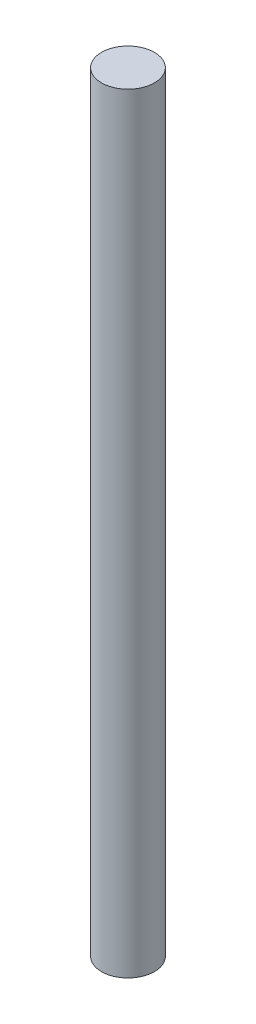
ISO-10303-21;
HEADER;
FILE_DESCRIPTION(('STEP AP214'),'2;1');
FILE_NAME('part.step','',(''),(''),'','','');
FILE_SCHEMA(('AUTOMOTIVE_DESIGN { 1 0 10303 214 1 1 1 1 }'));
ENDSEC;
DATA;
#1=APPLICATION_CONTEXT('core data for automotive mechanical design processes');
#2=APPLICATION_PROTOCOL_DEFINITION('international standard','automotive_design',2000,#1);
#3=PRODUCT_CONTEXT('',#1,'mechanical');
#4=PRODUCT('Part','Part','',(#3));
#5=PRODUCT_RELATED_PRODUCT_CATEGORY('part','',(#4));
#6=PRODUCT_DEFINITION_FORMATION('','',#4);
#7=PRODUCT_DEFINITION_CONTEXT('part definition',#1,'design');
#8=PRODUCT_DEFINITION('design','',#6,#7);
#9=PRODUCT_DEFINITION_SHAPE('','',#8);
#10=(LENGTH_UNIT() NAMED_UNIT(*) SI_UNIT(.MILLI.,.METRE.));
#11=(NAMED_UNIT(*) PLANE_ANGLE_UNIT() SI_UNIT($,.RADIAN.));
#12=(NAMED_UNIT(*) SI_UNIT($,.STERADIAN.) SOLID_ANGLE_UNIT());
#13=UNCERTAINTY_MEASURE_WITH_UNIT(LENGTH_MEASURE(1.E-05),#10,'distance_accuracy_value','');
#14=(GEOMETRIC_REPRESENTATION_CONTEXT(3) GLOBAL_UNCERTAINTY_ASSIGNED_CONTEXT((#13)) GLOBAL_UNIT_ASSIGNED_CONTEXT((#10,
#11,#12)) REPRESENTATION_CONTEXT('',''));
#15=CARTESIAN_POINT('',(0.,0.,0.));
#16=DIRECTION('',(0.,0.,1.));
#17=DIRECTION('',(1.,0.,0.));
#18=AXIS2_PLACEMENT_3D('',#15,#16,#17);
#19=CARTESIAN_POINT('',(0.,58.18,0.));
#20=DIRECTION('',(0.,-1.,0.));
#21=DIRECTION('',(0.,0.,-1.));
#22=AXIS2_PLACEMENT_3D('',#19,#20,#21);
#23=CYLINDRICAL_SURFACE('',#22,2.);
#24=CARTESIAN_POINT('',(0.,58.18,0.));
#25=DIRECTION('',(0.,1.,0.));
#26=DIRECTION('',(0.,0.,1.));
#27=AXIS2_PLACEMENT_3D('',#24,#25,#26);
#28=CIRCLE('',#27,2.);
#29=CARTESIAN_POINT('',(0.,58.18,2.));
#30=VERTEX_POINT('',#29);
#31=EDGE_CURVE('E10',#30,#30,#28,.T.);
#32=ORIENTED_EDGE('',*,*,#31,.F.);
#33=EDGE_LOOP('',(#32));
#34=FACE_BOUND('',#33,.T.);
#35=CARTESIAN_POINT('',(0.,0.,0.));
#36=DIRECTION('',(0.,1.,0.));
#37=DIRECTION('',(0.,0.,1.));
#38=AXIS2_PLACEMENT_3D('',#35,#36,#37);
#39=CIRCLE('',#38,2.);
#40=CARTESIAN_POINT('',(0.,0.,2.));
#41=VERTEX_POINT('',#40);
#42=EDGE_CURVE('E36',#41,#41,#39,.T.);
#43=ORIENTED_EDGE('',*,*,#42,.T.);
#44=EDGE_LOOP('',(#43));
#45=FACE_BOUND('',#44,.T.);
#46=ADVANCED_FACE('F33',(#34,#45),#23,.T.);
#47=CARTESIAN_POINT('',(0.,58.18,0.));
#48=DIRECTION('',(0.,1.,0.));
#49=DIRECTION('',(0.,0.,1.));
#50=AXIS2_PLACEMENT_3D('',#47,#48,#49);
#51=PLANE('',#50);
#52=ORIENTED_EDGE('',*,*,#31,.T.);
#53=EDGE_LOOP('',(#52));
#54=FACE_BOUND('',#53,.T.);
#55=ADVANCED_FACE('F48',(#54),#51,.T.);
#56=CARTESIAN_POINT('',(0.,0.,0.));
#57=DIRECTION('',(0.,1.,0.));
#58=DIRECTION('',(0.,0.,1.));
#59=AXIS2_PLACEMENT_3D('',#56,#57,#58);
#60=PLANE('',#59);
#61=ORIENTED_EDGE('',*,*,#42,.F.);
#62=EDGE_LOOP('',(#61));
#63=FACE_BOUND('',#62,.T.);
#64=ADVANCED_FACE('F46',(#63),#60,.F.);
#65=CLOSED_SHELL('',(#46,#55,#64));
#66=MANIFOLD_SOLID_BREP('B2',#65);
#67=ADVANCED_BREP_SHAPE_REPRESENTATION('',(#18,#66),#14);
#68=SHAPE_DEFINITION_REPRESENTATION(#9,#67);
ENDSEC;
END-ISO-10303-21;
